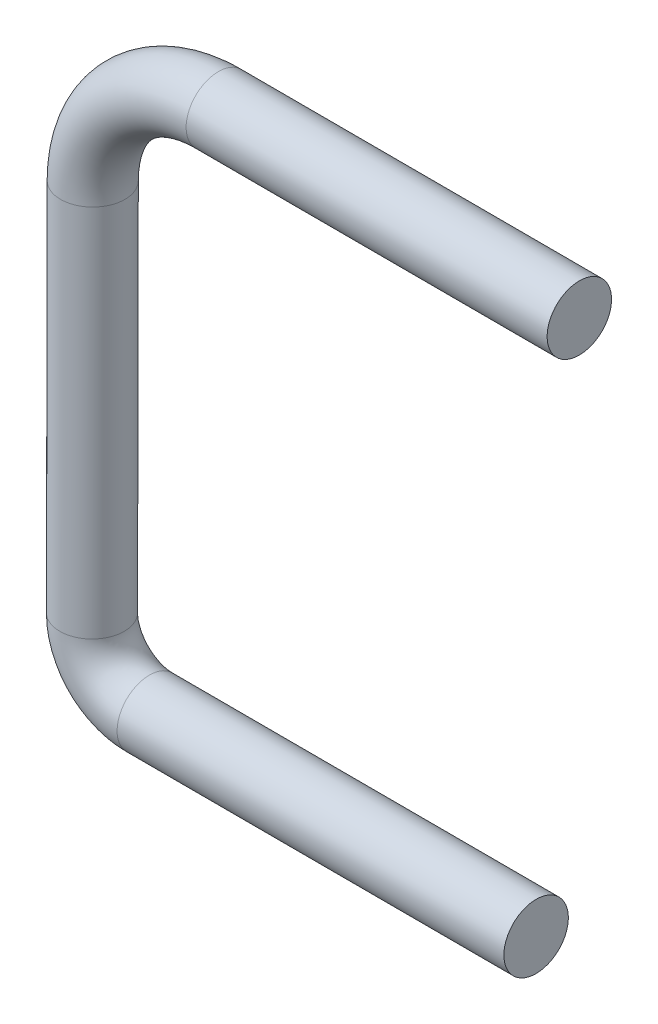
ISO-10303-21;
HEADER;
FILE_DESCRIPTION(('STEP AP214'),'2;1');
FILE_NAME('part.step','',(''),(''),'','','');
FILE_SCHEMA(('AUTOMOTIVE_DESIGN { 1 0 10303 214 1 1 1 1 }'));
ENDSEC;
DATA;
#1=APPLICATION_CONTEXT('core data for automotive mechanical design processes');
#2=APPLICATION_PROTOCOL_DEFINITION('international standard','automotive_design',2000,#1);
#3=PRODUCT_CONTEXT('',#1,'mechanical');
#4=PRODUCT('Part','Part','',(#3));
#5=PRODUCT_RELATED_PRODUCT_CATEGORY('part','',(#4));
#6=PRODUCT_DEFINITION_FORMATION('','',#4);
#7=PRODUCT_DEFINITION_CONTEXT('part definition',#1,'design');
#8=PRODUCT_DEFINITION('design','',#6,#7);
#9=PRODUCT_DEFINITION_SHAPE('','',#8);
#10=(LENGTH_UNIT() NAMED_UNIT(*) SI_UNIT(.MILLI.,.METRE.));
#11=(NAMED_UNIT(*) PLANE_ANGLE_UNIT() SI_UNIT($,.RADIAN.));
#12=(NAMED_UNIT(*) SI_UNIT($,.STERADIAN.) SOLID_ANGLE_UNIT());
#13=UNCERTAINTY_MEASURE_WITH_UNIT(LENGTH_MEASURE(1.E-05),#10,'distance_accuracy_value','');
#14=(GEOMETRIC_REPRESENTATION_CONTEXT(3) GLOBAL_UNCERTAINTY_ASSIGNED_CONTEXT((#13)) GLOBAL_UNIT_ASSIGNED_CONTEXT((#10,
#11,#12)) REPRESENTATION_CONTEXT('',''));
#15=CARTESIAN_POINT('',(0.,0.,0.));
#16=DIRECTION('',(0.,0.,1.));
#17=DIRECTION('',(1.,0.,0.));
#18=AXIS2_PLACEMENT_3D('',#15,#16,#17);
#19=CARTESIAN_POINT('',(297.874543561676,587.046511592949,2.9557646969603E-12));
#20=DIRECTION('',(-0.00191124803676596,-0.999998173563803,0.));
#21=DIRECTION('',(0.,0.,-1.));
#22=AXIS2_PLACEMENT_3D('',#19,#20,#21);
#23=CYLINDRICAL_SURFACE('',#22,25.);
#24=CARTESIAN_POINT('',(296.670457298514,-42.9523377522471,-4.72364944211669E-12));
#25=DIRECTION('',(0.00191124803676596,0.999998173563803,0.));
#26=DIRECTION('',(-0.999998173563803,0.00191124803676596,0.));
#27=AXIS2_PLACEMENT_3D('',#24,#25,#26);
#28=CIRCLE('',#27,25.);
#29=CARTESIAN_POINT('',(271.670502959419,-42.9045565513279,-5.02780622279362E-12));
#30=VERTEX_POINT('',#29);
#31=EDGE_CURVE('E12',#30,#30,#28,.T.);
#32=ORIENTED_EDGE('',*,*,#31,.T.);
#33=EDGE_LOOP('',(#32));
#34=FACE_BOUND('',#33,.T.);
#35=CARTESIAN_POINT('',(297.225553710523,247.483747718074,-1.18335887876542E-12));
#36=DIRECTION('',(0.00191124803676596,0.999998173563803,0.));
#37=DIRECTION('',(-0.999998173563803,0.00191124803676596,0.));
#38=AXIS2_PLACEMENT_3D('',#35,#36,#37);
#39=CIRCLE('',#38,25.);
#40=CARTESIAN_POINT('',(272.225599371428,247.531528918993,-1.48751565944235E-12));
#41=VERTEX_POINT('',#40);
#42=EDGE_CURVE('E116',#41,#41,#39,.T.);
#43=ORIENTED_EDGE('',*,*,#42,.F.);
#44=EDGE_LOOP('',(#43));
#45=FACE_BOUND('',#44,.T.);
#46=ADVANCED_FACE('F101',(#34,#45),#23,.T.);
#47=CARTESIAN_POINT('',(341.233759972067,-43.0375094325543,-4.18147922477661E-12));
#48=DIRECTION('',(0.,0.,1.));
#49=DIRECTION('',(0.00191124803676247,0.999998173563803,0.));
#50=AXIS2_PLACEMENT_3D('',#47,#48,#49);
#51=TOROIDAL_SURFACE('',#50,44.5633840657306,25.);
#52=CARTESIAN_POINT('',(341.148588291759,-87.6008121061072,-4.72468665601389E-12));
#53=DIRECTION('',(-0.999998173563803,0.00191124803676247,0.));
#54=DIRECTION('',(-0.00191124803676247,-0.999998173563803,0.));
#55=AXIS2_PLACEMENT_3D('',#52,#53,#54);
#56=CIRCLE('',#55,25.);
#57=CARTESIAN_POINT('',(341.10080709084,-112.600766445202,-5.02942531232647E-12));
#58=VERTEX_POINT('',#57);
#59=EDGE_CURVE('E124',#58,#58,#56,.T.);
#60=ORIENTED_EDGE('',*,*,#59,.T.);
#61=EDGE_LOOP('',(#60));
#62=FACE_BOUND('',#61,.T.);
#63=ORIENTED_EDGE('',*,*,#31,.F.);
#64=EDGE_LOOP('',(#63));
#65=FACE_BOUND('',#64,.T.);
#66=ADVANCED_FACE('F155',(#62,#65),#51,.T.);
#67=CARTESIAN_POINT('',(-358.850133202903,-86.2629384803734,-1.32410765149679E-11));
#68=DIRECTION('',(0.999998173563803,-0.00191124803676247,0.));
#69=DIRECTION('',(0.,0.,-1.));
#70=AXIS2_PLACEMENT_3D('',#67,#68,#69);
#71=CYLINDRICAL_SURFACE('',#70,25.);
#72=CARTESIAN_POINT('',(641.1480403609,-88.1741865171359,-1.07480528789074E-12));
#73=DIRECTION('',(-0.999998173563803,0.00191124803676247,0.));
#74=DIRECTION('',(0.,0.,1.));
#75=AXIS2_PLACEMENT_3D('',#72,#73,#74);
#76=CIRCLE('',#75,25.);
#77=CARTESIAN_POINT('',(641.1480403609,-88.1741865171362,24.9999999999989));
#78=VERTEX_POINT('',#77);
#79=EDGE_CURVE('E128',#78,#78,#76,.T.);
#80=ORIENTED_EDGE('',*,*,#79,.T.);
#81=EDGE_LOOP('',(#80));
#82=FACE_BOUND('',#81,.T.);
#83=ORIENTED_EDGE('',*,*,#59,.F.);
#84=EDGE_LOOP('',(#83));
#85=FACE_BOUND('',#84,.T.);
#86=ADVANCED_FACE('F151',(#82,#85),#71,.T.);
#87=CARTESIAN_POINT('',(394.490910971527,247.297849155432,-1.18562490203176E-12));
#88=DIRECTION('',(0.,0.,-1.));
#89=DIRECTION('',(0.,1.,0.));
#90=AXIS2_PLACEMENT_3D('',#87,#88,#89);
#91=TOROIDAL_SURFACE('',#90,97.2655349102975,25.);
#92=ORIENTED_EDGE('',*,*,#42,.T.);
#93=EDGE_LOOP('',(#92));
#94=FACE_BOUND('',#93,.T.);
#95=CARTESIAN_POINT('',(394.67680953417,344.563206416436,0.));
#96=DIRECTION('',(0.999998173563803,-0.00191124803676945,0.));
#97=DIRECTION('',(0.00191124803676945,0.999998173563803,0.));
#98=AXIS2_PLACEMENT_3D('',#95,#96,#97);
#99=CIRCLE('',#98,25.);
#100=CARTESIAN_POINT('',(394.724590735089,369.563160755531,0.));
#101=VERTEX_POINT('',#100);
#102=EDGE_CURVE('E110',#101,#101,#99,.T.);
#103=ORIENTED_EDGE('',*,*,#102,.F.);
#104=EDGE_LOOP('',(#103));
#105=FACE_BOUND('',#104,.T.);
#106=ADVANCED_FACE('F144',(#94,#105),#91,.T.);
#107=CARTESIAN_POINT('',(674.676298132035,344.02805696614,0.));
#108=DIRECTION('',(-0.999998173563803,0.00191124803676945,0.));
#109=DIRECTION('',(0.,0.,-1.));
#110=AXIS2_PLACEMENT_3D('',#107,#108,#109);
#111=CYLINDRICAL_SURFACE('',#110,25.);
#112=ORIENTED_EDGE('',*,*,#102,.T.);
#113=EDGE_LOOP('',(#112));
#114=FACE_BOUND('',#113,.T.);
#115=CARTESIAN_POINT('',(674.676298132035,344.02805696614,0.));
#116=DIRECTION('',(0.999998173563803,-0.00191124803676945,0.));
#117=DIRECTION('',(0.,0.,1.));
#118=AXIS2_PLACEMENT_3D('',#115,#116,#117);
#119=CIRCLE('',#118,25.);
#120=CARTESIAN_POINT('',(674.676298132035,344.02805696614,25.));
#121=VERTEX_POINT('',#120);
#122=EDGE_CURVE('E129',#121,#121,#119,.T.);
#123=ORIENTED_EDGE('',*,*,#122,.F.);
#124=EDGE_LOOP('',(#123));
#125=FACE_BOUND('',#124,.T.);
#126=ADVANCED_FACE('F142',(#114,#125),#111,.T.);
#127=CARTESIAN_POINT('',(674.676298132035,344.02805696614,0.));
#128=DIRECTION('',(0.999998173563803,-0.00191124803676945,0.));
#129=DIRECTION('',(0.,0.,1.));
#130=AXIS2_PLACEMENT_3D('',#127,#128,#129);
#131=PLANE('',#130);
#132=ORIENTED_EDGE('',*,*,#122,.T.);
#133=EDGE_LOOP('',(#132));
#134=FACE_BOUND('',#133,.T.);
#135=ADVANCED_FACE('F140',(#134),#131,.T.);
#136=CARTESIAN_POINT('',(641.1480403609,-88.1741865171359,-1.07480528789074E-12));
#137=DIRECTION('',(-0.999998173563803,0.00191124803676247,0.));
#138=DIRECTION('',(0.,0.,1.));
#139=AXIS2_PLACEMENT_3D('',#136,#137,#138);
#140=PLANE('',#139);
#141=ORIENTED_EDGE('',*,*,#79,.F.);
#142=EDGE_LOOP('',(#141));
#143=FACE_BOUND('',#142,.T.);
#144=ADVANCED_FACE('F103',(#143),#140,.F.);
#145=CLOSED_SHELL('',(#46,#66,#86,#106,#126,#135,#144));
#146=MANIFOLD_SOLID_BREP('B2',#145);
#147=ADVANCED_BREP_SHAPE_REPRESENTATION('',(#18,#146),#14);
#148=SHAPE_DEFINITION_REPRESENTATION(#9,#147);
ENDSEC;
END-ISO-10303-21;
